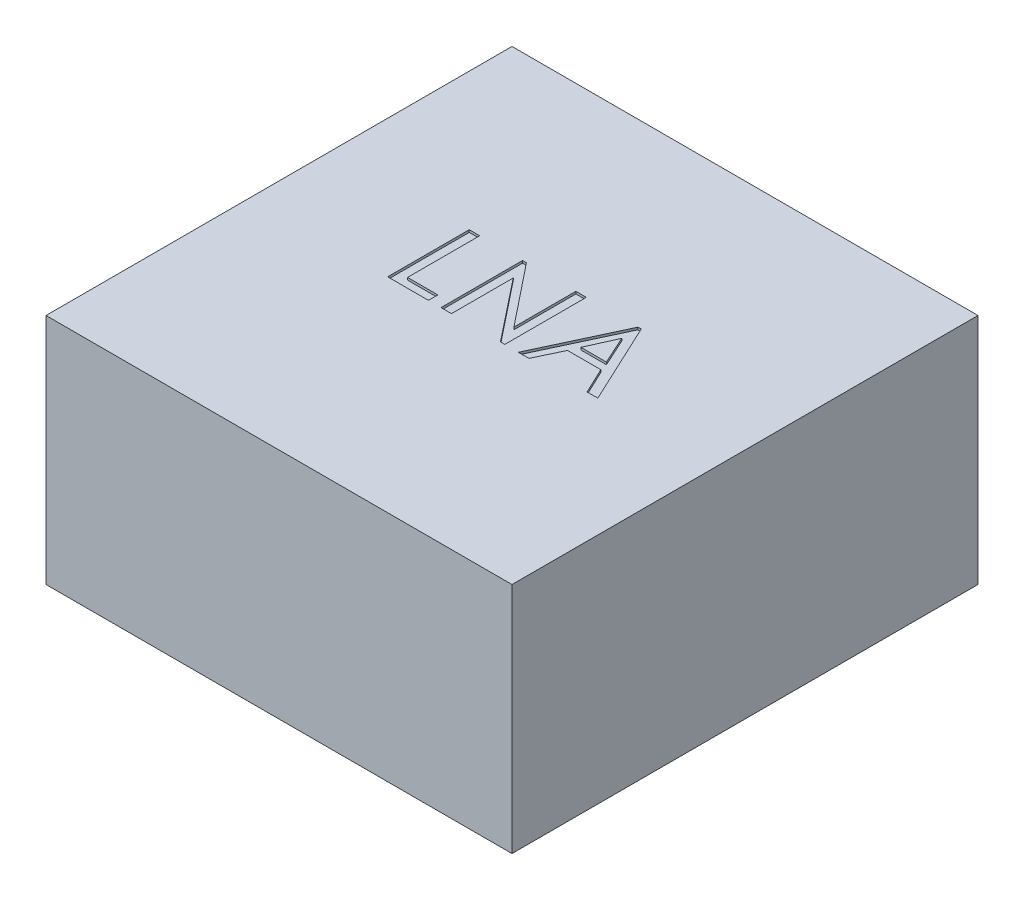
ISO-10303-21;
HEADER;
FILE_DESCRIPTION(('STEP AP214'),'2;1');
FILE_NAME('part.step','',(''),(''),'','','');
FILE_SCHEMA(('AUTOMOTIVE_DESIGN { 1 0 10303 214 1 1 1 1 }'));
ENDSEC;
DATA;
#1=APPLICATION_CONTEXT('core data for automotive mechanical design processes');
#2=APPLICATION_PROTOCOL_DEFINITION('international standard','automotive_design',2000,#1);
#3=PRODUCT_CONTEXT('',#1,'mechanical');
#4=PRODUCT('Part','Part','',(#3));
#5=PRODUCT_RELATED_PRODUCT_CATEGORY('part','',(#4));
#6=PRODUCT_DEFINITION_FORMATION('','',#4);
#7=PRODUCT_DEFINITION_CONTEXT('part definition',#1,'design');
#8=PRODUCT_DEFINITION('design','',#6,#7);
#9=PRODUCT_DEFINITION_SHAPE('','',#8);
#10=(LENGTH_UNIT() NAMED_UNIT(*) SI_UNIT(.MILLI.,.METRE.));
#11=(NAMED_UNIT(*) PLANE_ANGLE_UNIT() SI_UNIT($,.RADIAN.));
#12=(NAMED_UNIT(*) SI_UNIT($,.STERADIAN.) SOLID_ANGLE_UNIT());
#13=UNCERTAINTY_MEASURE_WITH_UNIT(LENGTH_MEASURE(1.E-05),#10,'distance_accuracy_value','');
#14=(GEOMETRIC_REPRESENTATION_CONTEXT(3) GLOBAL_UNCERTAINTY_ASSIGNED_CONTEXT((#13)) GLOBAL_UNIT_ASSIGNED_CONTEXT((#10,
#11,#12)) REPRESENTATION_CONTEXT('',''));
#15=CARTESIAN_POINT('',(0.,0.,0.));
#16=DIRECTION('',(0.,0.,1.));
#17=DIRECTION('',(1.,0.,0.));
#18=AXIS2_PLACEMENT_3D('',#15,#16,#17);
#19=CARTESIAN_POINT('',(0.,10.,0.));
#20=DIRECTION('',(0.,-1.,0.));
#21=DIRECTION('',(0.,0.,-1.));
#22=AXIS2_PLACEMENT_3D('',#19,#20,#21);
#23=PLANE('',#22);
#24=DIRECTION('',(-1.,0.,0.));
#25=VECTOR('',#24,1.);
#26=CARTESIAN_POINT('',(8.63198902594238,10.,-8.76979304217684));
#27=LINE('',#26,#25);
#28=CARTESIAN_POINT('',(8.63198902594238,10.,-8.76979304217684));
#29=VERTEX_POINT('',#28);
#30=CARTESIAN_POINT('',(8.18327107722443,10.,-8.76979304217684));
#31=VERTEX_POINT('',#30);
#32=EDGE_CURVE('E56',#29,#31,#27,.T.);
#33=ORIENTED_EDGE('',*,*,#32,.T.);
#34=DIRECTION('',(0.,0.,-1.));
#35=VECTOR('',#34,1.);
#36=CARTESIAN_POINT('',(8.18327107722443,10.,-8.76979304217684));
#37=LINE('',#36,#35);
#38=CARTESIAN_POINT('',(8.18327107722443,10.,-12.2697930421768));
#39=VERTEX_POINT('',#38);
#40=EDGE_CURVE('E293',#31,#39,#37,.T.);
#41=ORIENTED_EDGE('',*,*,#40,.T.);
#42=DIRECTION('',(1.,0.,0.));
#43=VECTOR('',#42,1.);
#44=CARTESIAN_POINT('',(8.18327107722443,10.,-12.2697930421768));
#45=LINE('',#44,#43);
#46=CARTESIAN_POINT('',(8.34943694260905,10.,-12.2697930421768));
#47=VERTEX_POINT('',#46);
#48=EDGE_CURVE('E297',#39,#47,#45,.T.);
#49=ORIENTED_EDGE('',*,*,#48,.T.);
#50=DIRECTION('',(0.62376479020186,0.,0.781612107444882));
#51=VECTOR('',#50,1.);
#52=CARTESIAN_POINT('',(8.34943694260905,10.,-12.2697930421768));
#53=LINE('',#52,#51);
#54=CARTESIAN_POINT('',(10.471732615686,10.,-9.61043807422813));
#55=VERTEX_POINT('',#54);
#56=EDGE_CURVE('E300',#47,#55,#53,.T.);
#57=ORIENTED_EDGE('',*,*,#56,.T.);
#58=DIRECTION('',(0.,0.,-1.));
#59=VECTOR('',#58,1.);
#60=CARTESIAN_POINT('',(10.471732615686,10.,-9.61043807422813));
#61=LINE('',#60,#59);
#62=CARTESIAN_POINT('',(10.471732615686,10.,-12.2697930421768));
#63=VERTEX_POINT('',#62);
#64=EDGE_CURVE('E303',#55,#63,#61,.T.);
#65=ORIENTED_EDGE('',*,*,#64,.T.);
#66=DIRECTION('',(1.,0.,0.));
#67=VECTOR('',#66,1.);
#68=CARTESIAN_POINT('',(10.471732615686,10.,-12.2697930421768));
#69=LINE('',#68,#67);
#70=CARTESIAN_POINT('',(10.9204505644039,10.,-12.2697930421768));
#71=VERTEX_POINT('',#70);
#72=EDGE_CURVE('E306',#63,#71,#69,.T.);
#73=ORIENTED_EDGE('',*,*,#72,.T.);
#74=DIRECTION('',(0.,0.,1.));
#75=VECTOR('',#74,1.);
#76=CARTESIAN_POINT('',(10.9204505644039,10.,-12.2697930421768));
#77=LINE('',#76,#75);
#78=CARTESIAN_POINT('',(10.9204505644039,10.,-8.76979304217684));
#79=VERTEX_POINT('',#78);
#80=EDGE_CURVE('E309',#71,#79,#77,.T.);
#81=ORIENTED_EDGE('',*,*,#80,.T.);
#82=DIRECTION('',(-1.,0.,0.));
#83=VECTOR('',#82,1.);
#84=CARTESIAN_POINT('',(10.9204505644039,10.,-8.76979304217684));
#85=LINE('',#84,#83);
#86=CARTESIAN_POINT('',(10.7367566541475,10.,-8.76979304217684));
#87=VERTEX_POINT('',#86);
#88=EDGE_CURVE('E312',#79,#87,#85,.T.);
#89=ORIENTED_EDGE('',*,*,#88,.T.);
#90=DIRECTION('',(-0.621609461028976,0.,-0.78332731214944));
#91=VECTOR('',#90,1.);
#92=CARTESIAN_POINT('',(10.7367566541475,10.,-8.76979304217684));
#93=LINE('',#92,#91);
#94=CARTESIAN_POINT('',(8.63198902594238,10.,-11.4221367921768));
#95=VERTEX_POINT('',#94);
#96=EDGE_CURVE('E315',#87,#95,#93,.T.);
#97=ORIENTED_EDGE('',*,*,#96,.T.);
#98=DIRECTION('',(0.,0.,1.));
#99=VECTOR('',#98,1.);
#100=CARTESIAN_POINT('',(8.63198902594238,10.,-11.4221367921768));
#101=LINE('',#100,#99);
#102=EDGE_CURVE('E273',#95,#29,#101,.T.);
#103=ORIENTED_EDGE('',*,*,#102,.T.);
#104=EDGE_LOOP('',(#33,#41,#49,#57,#65,#73,#81,#89,#97,#103));
#105=FACE_BOUND('',#104,.T.);
#106=DIRECTION('',(0.,0.,1.));
#107=VECTOR('',#106,1.);
#108=CARTESIAN_POINT('',(0.,10.,0.));
#109=LINE('',#108,#107);
#110=CARTESIAN_POINT('',(0.,10.,-20.));
#111=VERTEX_POINT('',#110);
#112=CARTESIAN_POINT('',(0.,10.,0.));
#113=VERTEX_POINT('',#112);
#114=EDGE_CURVE('E422',#111,#113,#109,.T.);
#115=ORIENTED_EDGE('',*,*,#114,.T.);
#116=DIRECTION('',(1.,0.,0.));
#117=VECTOR('',#116,1.);
#118=CARTESIAN_POINT('',(0.,10.,0.));
#119=LINE('',#118,#117);
#120=CARTESIAN_POINT('',(20.,10.,0.));
#121=VERTEX_POINT('',#120);
#122=EDGE_CURVE('E425',#113,#121,#119,.T.);
#123=ORIENTED_EDGE('',*,*,#122,.T.);
#124=DIRECTION('',(0.,0.,-1.));
#125=VECTOR('',#124,1.);
#126=CARTESIAN_POINT('',(20.,10.,0.));
#127=LINE('',#126,#125);
#128=CARTESIAN_POINT('',(20.,10.,-20.));
#129=VERTEX_POINT('',#128);
#130=EDGE_CURVE('E428',#121,#129,#127,.T.);
#131=ORIENTED_EDGE('',*,*,#130,.T.);
#132=DIRECTION('',(-1.,0.,0.));
#133=VECTOR('',#132,1.);
#134=CARTESIAN_POINT('',(0.,10.,-20.));
#135=LINE('',#134,#133);
#136=EDGE_CURVE('E430',#129,#111,#135,.T.);
#137=ORIENTED_EDGE('',*,*,#136,.T.);
#138=EDGE_LOOP('',(#115,#123,#131,#137));
#139=FACE_BOUND('',#138,.T.);
#140=DIRECTION('',(1.,0.,0.));
#141=VECTOR('',#140,1.);
#142=CARTESIAN_POINT('',(13.1359954361988,10.,-12.2697930421768));
#143=LINE('',#142,#141);
#144=CARTESIAN_POINT('',(13.1359954361988,10.,-12.2697930421768));
#145=VERTEX_POINT('',#144);
#146=CARTESIAN_POINT('',(13.2762197951731,10.,-12.2697930421768));
#147=VERTEX_POINT('',#146);
#148=EDGE_CURVE('E360',#145,#147,#143,.T.);
#149=ORIENTED_EDGE('',*,*,#148,.T.);
#150=DIRECTION('',(0.423838773095343,0.,0.905737652094156));
#151=VECTOR('',#150,1.);
#152=CARTESIAN_POINT('',(13.2762197951731,10.,-12.2697930421768));
#153=LINE('',#152,#151);
#154=CARTESIAN_POINT('',(14.9140403079937,10.,-8.76979304217684));
#155=VERTEX_POINT('',#154);
#156=EDGE_CURVE('E386',#147,#155,#153,.T.);
#157=ORIENTED_EDGE('',*,*,#156,.T.);
#158=DIRECTION('',(-1.,0.,0.));
#159=VECTOR('',#158,1.);
#160=CARTESIAN_POINT('',(14.9140403079937,10.,-8.76979304217684));
#161=LINE('',#160,#159);
#162=CARTESIAN_POINT('',(14.4534032887629,10.,-8.76979304217684));
#163=VERTEX_POINT('',#162);
#164=EDGE_CURVE('E389',#155,#163,#161,.T.);
#165=ORIENTED_EDGE('',*,*,#164,.T.);
#166=DIRECTION('',(-0.428134903458979,0.,-0.903714835797317));
#167=VECTOR('',#166,1.);
#168=CARTESIAN_POINT('',(14.4534032887629,10.,-8.76979304217684));
#169=LINE('',#168,#167);
#170=CARTESIAN_POINT('',(13.9219529682501,10.,-9.89158791397171));
#171=VERTEX_POINT('',#170);
#172=EDGE_CURVE('E392',#163,#171,#169,.T.);
#173=ORIENTED_EDGE('',*,*,#172,.T.);
#174=DIRECTION('',(-1.,0.,0.));
#175=VECTOR('',#174,1.);
#176=CARTESIAN_POINT('',(13.9219529682501,10.,-9.89158791397171));
#177=LINE('',#176,#175);
#178=CARTESIAN_POINT('',(12.4902622631219,10.,-9.89158791397171));
#179=VERTEX_POINT('',#178);
#180=EDGE_CURVE('E395',#171,#179,#177,.T.);
#181=ORIENTED_EDGE('',*,*,#180,.T.);
#182=DIRECTION('',(-0.428134903458979,0.,0.903714835797317));
#183=VECTOR('',#182,1.);
#184=CARTESIAN_POINT('',(12.4902622631219,10.,-9.89158791397171));
#185=LINE('',#184,#183);
#186=CARTESIAN_POINT('',(11.958811942609,10.,-8.76979304217684));
#187=VERTEX_POINT('',#186);
#188=EDGE_CURVE('E398',#179,#187,#185,.T.);
#189=ORIENTED_EDGE('',*,*,#188,.T.);
#190=DIRECTION('',(-1.,0.,0.));
#191=VECTOR('',#190,1.);
#192=CARTESIAN_POINT('',(11.958811942609,10.,-8.76979304217684));
#193=LINE('',#192,#191);
#194=CARTESIAN_POINT('',(11.5037838977373,10.,-8.76979304217684));
#195=VERTEX_POINT('',#194);
#196=EDGE_CURVE('E401',#187,#195,#193,.T.);
#197=ORIENTED_EDGE('',*,*,#196,.T.);
#198=DIRECTION('',(0.422646918669879,0.,-0.906294423539534));
#199=VECTOR('',#198,1.);
#200=CARTESIAN_POINT('',(11.5037838977373,10.,-8.76979304217684));
#201=LINE('',#200,#199);
#202=EDGE_CURVE('E369',#195,#145,#201,.T.);
#203=ORIENTED_EDGE('',*,*,#202,.T.);
#204=EDGE_LOOP('',(#149,#157,#165,#173,#181,#189,#197,#203));
#205=FACE_BOUND('',#204,.T.);
#206=DIRECTION('',(0.,0.,-1.));
#207=VECTOR('',#206,1.);
#208=CARTESIAN_POINT('',(5.89480953876289,10.,-8.76979304217684));
#209=LINE('',#208,#207);
#210=CARTESIAN_POINT('',(5.89480953876289,10.,-8.76979304217684));
#211=VERTEX_POINT('',#210);
#212=CARTESIAN_POINT('',(5.89480953876289,10.,-12.2697930421768));
#213=VERTEX_POINT('',#212);
#214=EDGE_CURVE('E48',#211,#213,#209,.T.);
#215=ORIENTED_EDGE('',*,*,#214,.T.);
#216=DIRECTION('',(1.,0.,0.));
#217=VECTOR('',#216,1.);
#218=CARTESIAN_POINT('',(5.89480953876289,10.,-12.2697930421768));
#219=LINE('',#218,#217);
#220=CARTESIAN_POINT('',(6.34352748748084,10.,-12.2697930421768));
#221=VERTEX_POINT('',#220);
#222=EDGE_CURVE('E258',#213,#221,#219,.T.);
#223=ORIENTED_EDGE('',*,*,#222,.T.);
#224=DIRECTION('',(0.,0.,1.));
#225=VECTOR('',#224,1.);
#226=CARTESIAN_POINT('',(6.34352748748084,10.,-12.2697930421768));
#227=LINE('',#226,#225);
#228=CARTESIAN_POINT('',(6.34352748748084,10.,-9.173639196023));
#229=VERTEX_POINT('',#228);
#230=EDGE_CURVE('E853',#221,#229,#227,.T.);
#231=ORIENTED_EDGE('',*,*,#230,.T.);
#232=DIRECTION('',(1.,0.,0.));
#233=VECTOR('',#232,1.);
#234=CARTESIAN_POINT('',(6.34352748748084,10.,-9.173639196023));
#235=LINE('',#234,#233);
#236=CARTESIAN_POINT('',(7.64480953876289,10.,-9.173639196023));
#237=VERTEX_POINT('',#236);
#238=EDGE_CURVE('E850',#229,#237,#235,.T.);
#239=ORIENTED_EDGE('',*,*,#238,.T.);
#240=DIRECTION('',(0.,0.,1.));
#241=VECTOR('',#240,1.);
#242=CARTESIAN_POINT('',(7.64480953876289,10.,-9.173639196023));
#243=LINE('',#242,#241);
#244=CARTESIAN_POINT('',(7.64480953876289,10.,-8.76979304217684));
#245=VERTEX_POINT('',#244);
#246=EDGE_CURVE('E844',#237,#245,#243,.T.);
#247=ORIENTED_EDGE('',*,*,#246,.T.);
#248=DIRECTION('',(-1.,0.,0.));
#249=VECTOR('',#248,1.);
#250=CARTESIAN_POINT('',(7.64480953876289,10.,-8.76979304217684));
#251=LINE('',#250,#249);
#252=EDGE_CURVE('E254',#245,#211,#251,.T.);
#253=ORIENTED_EDGE('',*,*,#252,.T.);
#254=EDGE_LOOP('',(#215,#223,#231,#239,#247,#253));
#255=FACE_BOUND('',#254,.T.);
#256=ADVANCED_FACE('F33',(#105,#139,#205,#255),#23,.F.);
#257=CARTESIAN_POINT('',(0.,10.,0.));
#258=DIRECTION('',(1.,0.,0.));
#259=DIRECTION('',(0.,0.,-1.));
#260=AXIS2_PLACEMENT_3D('',#257,#258,#259);
#261=PLANE('',#260);
#262=DIRECTION('',(0.,0.,1.));
#263=VECTOR('',#262,1.);
#264=CARTESIAN_POINT('',(0.,0.,0.));
#265=LINE('',#264,#263);
#266=CARTESIAN_POINT('',(0.,0.,-20.));
#267=VERTEX_POINT('',#266);
#268=CARTESIAN_POINT('',(0.,0.,0.));
#269=VERTEX_POINT('',#268);
#270=EDGE_CURVE('E259',#267,#269,#265,.T.);
#271=ORIENTED_EDGE('',*,*,#270,.T.);
#272=DIRECTION('',(0.,-1.,0.));
#273=VECTOR('',#272,1.);
#274=CARTESIAN_POINT('',(0.,10.,0.));
#275=LINE('',#274,#273);
#276=EDGE_CURVE('E11',#113,#269,#275,.T.);
#277=ORIENTED_EDGE('',*,*,#276,.F.);
#278=ORIENTED_EDGE('',*,*,#114,.F.);
#279=DIRECTION('',(0.,-1.,0.));
#280=VECTOR('',#279,1.);
#281=CARTESIAN_POINT('',(0.,10.,-20.));
#282=LINE('',#281,#280);
#283=EDGE_CURVE('E431',#111,#267,#282,.T.);
#284=ORIENTED_EDGE('',*,*,#283,.T.);
#285=EDGE_LOOP('',(#271,#277,#278,#284));
#286=FACE_BOUND('',#285,.T.);
#287=ADVANCED_FACE('F35',(#286),#261,.F.);
#288=CARTESIAN_POINT('',(0.,10.,0.));
#289=DIRECTION('',(0.,0.,-1.));
#290=DIRECTION('',(-1.,0.,0.));
#291=AXIS2_PLACEMENT_3D('',#288,#289,#290);
#292=PLANE('',#291);
#293=DIRECTION('',(1.,0.,0.));
#294=VECTOR('',#293,1.);
#295=CARTESIAN_POINT('',(0.,0.,0.));
#296=LINE('',#295,#294);
#297=CARTESIAN_POINT('',(20.,0.,0.));
#298=VERTEX_POINT('',#297);
#299=EDGE_CURVE('E263',#269,#298,#296,.T.);
#300=ORIENTED_EDGE('',*,*,#299,.T.);
#301=DIRECTION('',(0.,-1.,0.));
#302=VECTOR('',#301,1.);
#303=CARTESIAN_POINT('',(20.,10.,0.));
#304=LINE('',#303,#302);
#305=EDGE_CURVE('E41',#121,#298,#304,.T.);
#306=ORIENTED_EDGE('',*,*,#305,.F.);
#307=ORIENTED_EDGE('',*,*,#122,.F.);
#308=ORIENTED_EDGE('',*,*,#276,.T.);
#309=EDGE_LOOP('',(#300,#306,#307,#308));
#310=FACE_BOUND('',#309,.T.);
#311=ADVANCED_FACE('F462',(#310),#292,.F.);
#312=CARTESIAN_POINT('',(20.,10.,0.));
#313=DIRECTION('',(-1.,0.,0.));
#314=DIRECTION('',(0.,0.,1.));
#315=AXIS2_PLACEMENT_3D('',#312,#313,#314);
#316=PLANE('',#315);
#317=DIRECTION('',(0.,0.,-1.));
#318=VECTOR('',#317,1.);
#319=CARTESIAN_POINT('',(20.,0.,0.));
#320=LINE('',#319,#318);
#321=CARTESIAN_POINT('',(20.,0.,-20.));
#322=VERTEX_POINT('',#321);
#323=EDGE_CURVE('E434',#298,#322,#320,.T.);
#324=ORIENTED_EDGE('',*,*,#323,.T.);
#325=DIRECTION('',(0.,-1.,0.));
#326=VECTOR('',#325,1.);
#327=CARTESIAN_POINT('',(20.,10.,-20.));
#328=LINE('',#327,#326);
#329=EDGE_CURVE('E439',#129,#322,#328,.T.);
#330=ORIENTED_EDGE('',*,*,#329,.F.);
#331=ORIENTED_EDGE('',*,*,#130,.F.);
#332=ORIENTED_EDGE('',*,*,#305,.T.);
#333=EDGE_LOOP('',(#324,#330,#331,#332));
#334=FACE_BOUND('',#333,.T.);
#335=ADVANCED_FACE('F446',(#334),#316,.F.);
#336=CARTESIAN_POINT('',(0.,10.,-20.));
#337=DIRECTION('',(0.,0.,1.));
#338=DIRECTION('',(1.,0.,0.));
#339=AXIS2_PLACEMENT_3D('',#336,#337,#338);
#340=PLANE('',#339);
#341=DIRECTION('',(-1.,0.,0.));
#342=VECTOR('',#341,1.);
#343=CARTESIAN_POINT('',(0.,0.,-20.));
#344=LINE('',#343,#342);
#345=EDGE_CURVE('E426',#322,#267,#344,.T.);
#346=ORIENTED_EDGE('',*,*,#345,.T.);
#347=ORIENTED_EDGE('',*,*,#283,.F.);
#348=ORIENTED_EDGE('',*,*,#136,.F.);
#349=ORIENTED_EDGE('',*,*,#329,.T.);
#350=EDGE_LOOP('',(#346,#347,#348,#349));
#351=FACE_BOUND('',#350,.T.);
#352=ADVANCED_FACE('F455',(#351),#340,.F.);
#353=CARTESIAN_POINT('',(0.,0.,0.));
#354=DIRECTION('',(0.,-1.,0.));
#355=DIRECTION('',(0.,0.,-1.));
#356=AXIS2_PLACEMENT_3D('',#353,#354,#355);
#357=PLANE('',#356);
#358=ORIENTED_EDGE('',*,*,#270,.F.);
#359=ORIENTED_EDGE('',*,*,#345,.F.);
#360=ORIENTED_EDGE('',*,*,#323,.F.);
#361=ORIENTED_EDGE('',*,*,#299,.F.);
#362=EDGE_LOOP('',(#358,#359,#360,#361));
#363=FACE_BOUND('',#362,.T.);
#364=ADVANCED_FACE('F452',(#363),#357,.T.);
#365=CARTESIAN_POINT('',(13.1359954361988,9.9,-12.2697930421768));
#366=DIRECTION('',(0.,0.,1.));
#367=DIRECTION('',(1.,0.,0.));
#368=AXIS2_PLACEMENT_3D('',#365,#366,#367);
#369=PLANE('',#368);
#370=ORIENTED_EDGE('',*,*,#148,.F.);
#371=DIRECTION('',(0.,1.,0.));
#372=VECTOR('',#371,1.);
#373=CARTESIAN_POINT('',(13.1359954361988,9.9,-12.2697930421768));
#374=LINE('',#373,#372);
#375=CARTESIAN_POINT('',(13.1359954361988,9.9,-12.2697930421768));
#376=VERTEX_POINT('',#375);
#377=EDGE_CURVE('E383',#376,#145,#374,.T.);
#378=ORIENTED_EDGE('',*,*,#377,.F.);
#379=DIRECTION('',(1.,0.,0.));
#380=VECTOR('',#379,1.);
#381=CARTESIAN_POINT('',(13.1359954361988,9.9,-12.2697930421768));
#382=LINE('',#381,#380);
#383=CARTESIAN_POINT('',(13.2762197951731,9.9,-12.2697930421768));
#384=VERTEX_POINT('',#383);
#385=EDGE_CURVE('E365',#376,#384,#382,.T.);
#386=ORIENTED_EDGE('',*,*,#385,.T.);
#387=DIRECTION('',(0.,1.,0.));
#388=VECTOR('',#387,1.);
#389=CARTESIAN_POINT('',(13.2762197951731,9.9,-12.2697930421768));
#390=LINE('',#389,#388);
#391=EDGE_CURVE('E294',#384,#147,#390,.T.);
#392=ORIENTED_EDGE('',*,*,#391,.T.);
#393=EDGE_LOOP('',(#370,#378,#386,#392));
#394=FACE_BOUND('',#393,.T.);
#395=ADVANCED_FACE('F508',(#394),#369,.T.);
#396=CARTESIAN_POINT('',(13.2762197951731,9.9,-12.2697930421768));
#397=DIRECTION('',(-0.905737652094156,0.,0.423838773095343));
#398=DIRECTION('',(0.423838773095343,0.,0.905737652094156));
#399=AXIS2_PLACEMENT_3D('',#396,#397,#398);
#400=PLANE('',#399);
#401=ORIENTED_EDGE('',*,*,#156,.F.);
#402=ORIENTED_EDGE('',*,*,#391,.F.);
#403=DIRECTION('',(0.423838773095343,0.,0.905737652094156));
#404=VECTOR('',#403,1.);
#405=CARTESIAN_POINT('',(13.2762197951731,9.9,-12.2697930421768));
#406=LINE('',#405,#404);
#407=CARTESIAN_POINT('',(14.9140403079937,9.9,-8.76979304217684));
#408=VERTEX_POINT('',#407);
#409=EDGE_CURVE('E368',#384,#408,#406,.T.);
#410=ORIENTED_EDGE('',*,*,#409,.T.);
#411=DIRECTION('',(0.,1.,0.));
#412=VECTOR('',#411,1.);
#413=CARTESIAN_POINT('',(14.9140403079937,9.9,-8.76979304217684));
#414=LINE('',#413,#412);
#415=EDGE_CURVE('E418',#408,#155,#414,.T.);
#416=ORIENTED_EDGE('',*,*,#415,.T.);
#417=EDGE_LOOP('',(#401,#402,#410,#416));
#418=FACE_BOUND('',#417,.T.);
#419=ADVANCED_FACE('F510',(#418),#400,.T.);
#420=CARTESIAN_POINT('',(14.9140403079937,9.9,-8.76979304217684));
#421=DIRECTION('',(0.,0.,-1.));
#422=DIRECTION('',(-1.,0.,0.));
#423=AXIS2_PLACEMENT_3D('',#420,#421,#422);
#424=PLANE('',#423);
#425=ORIENTED_EDGE('',*,*,#164,.F.);
#426=ORIENTED_EDGE('',*,*,#415,.F.);
#427=DIRECTION('',(-1.,0.,0.));
#428=VECTOR('',#427,1.);
#429=CARTESIAN_POINT('',(14.9140403079937,9.9,-8.76979304217684));
#430=LINE('',#429,#428);
#431=CARTESIAN_POINT('',(14.4534032887629,9.9,-8.76979304217684));
#432=VERTEX_POINT('',#431);
#433=EDGE_CURVE('E371',#408,#432,#430,.T.);
#434=ORIENTED_EDGE('',*,*,#433,.T.);
#435=DIRECTION('',(0.,1.,0.));
#436=VECTOR('',#435,1.);
#437=CARTESIAN_POINT('',(14.4534032887629,9.9,-8.76979304217684));
#438=LINE('',#437,#436);
#439=EDGE_CURVE('E416',#432,#163,#438,.T.);
#440=ORIENTED_EDGE('',*,*,#439,.T.);
#441=EDGE_LOOP('',(#425,#426,#434,#440));
#442=FACE_BOUND('',#441,.T.);
#443=ADVANCED_FACE('F537',(#442),#424,.T.);
#444=CARTESIAN_POINT('',(14.4534032887629,9.9,-8.76979304217684));
#445=DIRECTION('',(0.903714835797317,0.,-0.428134903458979));
#446=DIRECTION('',(-0.428134903458979,0.,-0.903714835797317));
#447=AXIS2_PLACEMENT_3D('',#444,#445,#446);
#448=PLANE('',#447);
#449=ORIENTED_EDGE('',*,*,#172,.F.);
#450=ORIENTED_EDGE('',*,*,#439,.F.);
#451=DIRECTION('',(-0.428134903458979,0.,-0.903714835797317));
#452=VECTOR('',#451,1.);
#453=CARTESIAN_POINT('',(14.4534032887629,9.9,-8.76979304217684));
#454=LINE('',#453,#452);
#455=CARTESIAN_POINT('',(13.9219529682501,9.9,-9.89158791397171));
#456=VERTEX_POINT('',#455);
#457=EDGE_CURVE('E373',#432,#456,#454,.T.);
#458=ORIENTED_EDGE('',*,*,#457,.T.);
#459=DIRECTION('',(0.,1.,0.));
#460=VECTOR('',#459,1.);
#461=CARTESIAN_POINT('',(13.9219529682501,9.9,-9.89158791397171));
#462=LINE('',#461,#460);
#463=EDGE_CURVE('E414',#456,#171,#462,.T.);
#464=ORIENTED_EDGE('',*,*,#463,.T.);
#465=EDGE_LOOP('',(#449,#450,#458,#464));
#466=FACE_BOUND('',#465,.T.);
#467=ADVANCED_FACE('F534',(#466),#448,.T.);
#468=CARTESIAN_POINT('',(13.9219529682501,9.9,-9.89158791397171));
#469=DIRECTION('',(0.,0.,-1.));
#470=DIRECTION('',(-1.,0.,0.));
#471=AXIS2_PLACEMENT_3D('',#468,#469,#470);
#472=PLANE('',#471);
#473=ORIENTED_EDGE('',*,*,#180,.F.);
#474=ORIENTED_EDGE('',*,*,#463,.F.);
#475=DIRECTION('',(-1.,0.,0.));
#476=VECTOR('',#475,1.);
#477=CARTESIAN_POINT('',(13.9219529682501,9.9,-9.89158791397171));
#478=LINE('',#477,#476);
#479=CARTESIAN_POINT('',(12.4902622631219,9.9,-9.89158791397171));
#480=VERTEX_POINT('',#479);
#481=EDGE_CURVE('E375',#456,#480,#478,.T.);
#482=ORIENTED_EDGE('',*,*,#481,.T.);
#483=DIRECTION('',(0.,1.,0.));
#484=VECTOR('',#483,1.);
#485=CARTESIAN_POINT('',(12.4902622631219,9.9,-9.89158791397171));
#486=LINE('',#485,#484);
#487=EDGE_CURVE('E412',#480,#179,#486,.T.);
#488=ORIENTED_EDGE('',*,*,#487,.T.);
#489=EDGE_LOOP('',(#473,#474,#482,#488));
#490=FACE_BOUND('',#489,.T.);
#491=ADVANCED_FACE('F530',(#490),#472,.T.);
#492=CARTESIAN_POINT('',(12.4902622631219,9.9,-9.89158791397171));
#493=DIRECTION('',(-0.903714835797317,0.,-0.428134903458979));
#494=DIRECTION('',(-0.428134903458979,0.,0.903714835797317));
#495=AXIS2_PLACEMENT_3D('',#492,#493,#494);
#496=PLANE('',#495);
#497=ORIENTED_EDGE('',*,*,#188,.F.);
#498=ORIENTED_EDGE('',*,*,#487,.F.);
#499=DIRECTION('',(-0.428134903458979,0.,0.903714835797317));
#500=VECTOR('',#499,1.);
#501=CARTESIAN_POINT('',(12.4902622631219,9.9,-9.89158791397171));
#502=LINE('',#501,#500);
#503=CARTESIAN_POINT('',(11.958811942609,9.9,-8.76979304217684));
#504=VERTEX_POINT('',#503);
#505=EDGE_CURVE('E377',#480,#504,#502,.T.);
#506=ORIENTED_EDGE('',*,*,#505,.T.);
#507=DIRECTION('',(0.,1.,0.));
#508=VECTOR('',#507,1.);
#509=CARTESIAN_POINT('',(11.958811942609,9.9,-8.76979304217684));
#510=LINE('',#509,#508);
#511=EDGE_CURVE('E410',#504,#187,#510,.T.);
#512=ORIENTED_EDGE('',*,*,#511,.T.);
#513=EDGE_LOOP('',(#497,#498,#506,#512));
#514=FACE_BOUND('',#513,.T.);
#515=ADVANCED_FACE('F527',(#514),#496,.T.);
#516=CARTESIAN_POINT('',(11.958811942609,9.9,-8.76979304217684));
#517=DIRECTION('',(0.,0.,-1.));
#518=DIRECTION('',(-1.,0.,0.));
#519=AXIS2_PLACEMENT_3D('',#516,#517,#518);
#520=PLANE('',#519);
#521=ORIENTED_EDGE('',*,*,#196,.F.);
#522=ORIENTED_EDGE('',*,*,#511,.F.);
#523=DIRECTION('',(-1.,0.,0.));
#524=VECTOR('',#523,1.);
#525=CARTESIAN_POINT('',(11.958811942609,9.9,-8.76979304217684));
#526=LINE('',#525,#524);
#527=CARTESIAN_POINT('',(11.5037838977373,9.9,-8.76979304217684));
#528=VERTEX_POINT('',#527);
#529=EDGE_CURVE('E379',#504,#528,#526,.T.);
#530=ORIENTED_EDGE('',*,*,#529,.T.);
#531=DIRECTION('',(0.,1.,0.));
#532=VECTOR('',#531,1.);
#533=CARTESIAN_POINT('',(11.5037838977373,9.9,-8.76979304217684));
#534=LINE('',#533,#532);
#535=EDGE_CURVE('E408',#528,#195,#534,.T.);
#536=ORIENTED_EDGE('',*,*,#535,.T.);
#537=EDGE_LOOP('',(#521,#522,#530,#536));
#538=FACE_BOUND('',#537,.T.);
#539=ADVANCED_FACE('F519',(#538),#520,.T.);
#540=CARTESIAN_POINT('',(11.5037838977373,9.9,-8.76979304217684));
#541=DIRECTION('',(0.906294423539534,0.,0.422646918669879));
#542=DIRECTION('',(0.422646918669879,0.,-0.906294423539534));
#543=AXIS2_PLACEMENT_3D('',#540,#541,#542);
#544=PLANE('',#543);
#545=ORIENTED_EDGE('',*,*,#202,.F.);
#546=ORIENTED_EDGE('',*,*,#535,.F.);
#547=DIRECTION('',(0.422646918669879,0.,-0.906294423539534));
#548=VECTOR('',#547,1.);
#549=CARTESIAN_POINT('',(11.5037838977373,9.9,-8.76979304217684));
#550=LINE('',#549,#548);
#551=EDGE_CURVE('E381',#528,#376,#550,.T.);
#552=ORIENTED_EDGE('',*,*,#551,.T.);
#553=ORIENTED_EDGE('',*,*,#377,.T.);
#554=EDGE_LOOP('',(#545,#546,#552,#553));
#555=FACE_BOUND('',#554,.T.);
#556=ADVANCED_FACE('F499',(#555),#544,.T.);
#557=CARTESIAN_POINT('',(0.,9.9,0.));
#558=DIRECTION('',(0.,1.,0.));
#559=DIRECTION('',(0.,0.,1.));
#560=AXIS2_PLACEMENT_3D('',#557,#558,#559);
#561=PLANE('',#560);
#562=DIRECTION('',(1.,0.,0.));
#563=VECTOR('',#562,1.);
#564=CARTESIAN_POINT('',(12.6613359810706,9.9,-10.2954340678179));
#565=LINE('',#564,#563);
#566=CARTESIAN_POINT('',(12.6613359810706,9.9,-10.2954340678179));
#567=VERTEX_POINT('',#566);
#568=CARTESIAN_POINT('',(13.7564882246603,9.9,-10.2954340678179));
#569=VERTEX_POINT('',#568);
#570=EDGE_CURVE('E346',#567,#569,#565,.T.);
#571=ORIENTED_EDGE('',*,*,#570,.F.);
#572=DIRECTION('',(-0.410694316281437,0.,0.911773095991609));
#573=VECTOR('',#572,1.);
#574=CARTESIAN_POINT('',(13.206107615686,9.9,-11.5048691639717));
#575=LINE('',#574,#573);
#576=CARTESIAN_POINT('',(13.206107615686,9.9,-11.5048691639717));
#577=VERTEX_POINT('',#576);
#578=EDGE_CURVE('E342',#577,#567,#575,.T.);
#579=ORIENTED_EDGE('',*,*,#578,.F.);
#580=DIRECTION('',(-0.414200444755634,0.,-0.910185690705054));
#581=VECTOR('',#580,1.);
#582=CARTESIAN_POINT('',(13.7564882246603,9.9,-10.2954340678179));
#583=LINE('',#582,#581);
#584=EDGE_CURVE('E339',#569,#577,#583,.T.);
#585=ORIENTED_EDGE('',*,*,#584,.F.);
#586=EDGE_LOOP('',(#571,#579,#585));
#587=FACE_BOUND('',#586,.T.);
#588=ORIENTED_EDGE('',*,*,#385,.F.);
#589=ORIENTED_EDGE('',*,*,#551,.F.);
#590=ORIENTED_EDGE('',*,*,#529,.F.);
#591=ORIENTED_EDGE('',*,*,#505,.F.);
#592=ORIENTED_EDGE('',*,*,#481,.F.);
#593=ORIENTED_EDGE('',*,*,#457,.F.);
#594=ORIENTED_EDGE('',*,*,#433,.F.);
#595=ORIENTED_EDGE('',*,*,#409,.F.);
#596=EDGE_LOOP('',(#588,#589,#590,#591,#592,#593,#594,#595));
#597=FACE_BOUND('',#596,.T.);
#598=ADVANCED_FACE('F496',(#587,#597),#561,.T.);
#599=CARTESIAN_POINT('',(13.7564882246603,9.9,-10.2954340678179));
#600=DIRECTION('',(0.910185690705054,0.,-0.414200444755634));
#601=DIRECTION('',(-0.414200444755634,0.,-0.910185690705054));
#602=AXIS2_PLACEMENT_3D('',#599,#600,#601);
#603=PLANE('',#602);
#604=DIRECTION('',(-0.414200444755634,0.,-0.910185690705054));
#605=VECTOR('',#604,1.);
#606=CARTESIAN_POINT('',(13.7564882246603,10.,-10.2954340678179));
#607=LINE('',#606,#605);
#608=CARTESIAN_POINT('',(13.7564882246603,10.,-10.2954340678179));
#609=VERTEX_POINT('',#608);
#610=CARTESIAN_POINT('',(13.206107615686,10.,-11.5048691639717));
#611=VERTEX_POINT('',#610);
#612=EDGE_CURVE('E350',#609,#611,#607,.T.);
#613=ORIENTED_EDGE('',*,*,#612,.F.);
#614=DIRECTION('',(0.,1.,0.));
#615=VECTOR('',#614,1.);
#616=CARTESIAN_POINT('',(13.7564882246603,9.9,-10.2954340678179));
#617=LINE('',#616,#615);
#618=EDGE_CURVE('E358',#569,#609,#617,.T.);
#619=ORIENTED_EDGE('',*,*,#618,.F.);
#620=ORIENTED_EDGE('',*,*,#584,.T.);
#621=DIRECTION('',(0.,1.,0.));
#622=VECTOR('',#621,1.);
#623=CARTESIAN_POINT('',(13.206107615686,9.9,-11.5048691639717));
#624=LINE('',#623,#622);
#625=EDGE_CURVE('E349',#577,#611,#624,.T.);
#626=ORIENTED_EDGE('',*,*,#625,.T.);
#627=EDGE_LOOP('',(#613,#619,#620,#626));
#628=FACE_BOUND('',#627,.T.);
#629=ADVANCED_FACE('F487',(#628),#603,.T.);
#630=CARTESIAN_POINT('',(12.6613359810706,9.9,-10.2954340678179));
#631=DIRECTION('',(0.,0.,1.));
#632=DIRECTION('',(1.,0.,0.));
#633=AXIS2_PLACEMENT_3D('',#630,#631,#632);
#634=PLANE('',#633);
#635=DIRECTION('',(1.,0.,0.));
#636=VECTOR('',#635,1.);
#637=CARTESIAN_POINT('',(12.6613359810706,10.,-10.2954340678179));
#638=LINE('',#637,#636);
#639=CARTESIAN_POINT('',(12.6613359810706,10.,-10.2954340678179));
#640=VERTEX_POINT('',#639);
#641=EDGE_CURVE('E343',#640,#609,#638,.T.);
#642=ORIENTED_EDGE('',*,*,#641,.F.);
#643=DIRECTION('',(0.,1.,0.));
#644=VECTOR('',#643,1.);
#645=CARTESIAN_POINT('',(12.6613359810706,9.9,-10.2954340678179));
#646=LINE('',#645,#644);
#647=EDGE_CURVE('E361',#567,#640,#646,.T.);
#648=ORIENTED_EDGE('',*,*,#647,.F.);
#649=ORIENTED_EDGE('',*,*,#570,.T.);
#650=ORIENTED_EDGE('',*,*,#618,.T.);
#651=EDGE_LOOP('',(#642,#648,#649,#650));
#652=FACE_BOUND('',#651,.T.);
#653=ADVANCED_FACE('F494',(#652),#634,.T.);
#654=CARTESIAN_POINT('',(13.206107615686,9.9,-11.5048691639717));
#655=DIRECTION('',(-0.911773095991609,0.,-0.410694316281437));
#656=DIRECTION('',(-0.410694316281437,0.,0.911773095991609));
#657=AXIS2_PLACEMENT_3D('',#654,#655,#656);
#658=PLANE('',#657);
#659=DIRECTION('',(-0.410694316281437,0.,0.911773095991609));
#660=VECTOR('',#659,1.);
#661=CARTESIAN_POINT('',(13.206107615686,10.,-11.5048691639717));
#662=LINE('',#661,#660);
#663=EDGE_CURVE('E353',#611,#640,#662,.T.);
#664=ORIENTED_EDGE('',*,*,#663,.F.);
#665=ORIENTED_EDGE('',*,*,#625,.F.);
#666=ORIENTED_EDGE('',*,*,#578,.T.);
#667=ORIENTED_EDGE('',*,*,#647,.T.);
#668=EDGE_LOOP('',(#664,#665,#666,#667));
#669=FACE_BOUND('',#668,.T.);
#670=ADVANCED_FACE('F491',(#669),#658,.T.);
#671=CARTESIAN_POINT('',(8.63198902594238,9.9,-8.76979304217684));
#672=DIRECTION('',(0.,0.,-1.));
#673=DIRECTION('',(-1.,0.,0.));
#674=AXIS2_PLACEMENT_3D('',#671,#672,#673);
#675=PLANE('',#674);
#676=ORIENTED_EDGE('',*,*,#32,.F.);
#677=DIRECTION('',(0.,1.,0.));
#678=VECTOR('',#677,1.);
#679=CARTESIAN_POINT('',(8.63198902594238,9.9,-8.76979304217684));
#680=LINE('',#679,#678);
#681=CARTESIAN_POINT('',(8.63198902594238,9.9,-8.76979304217684));
#682=VERTEX_POINT('',#681);
#683=EDGE_CURVE('E291',#682,#29,#680,.T.);
#684=ORIENTED_EDGE('',*,*,#683,.F.);
#685=DIRECTION('',(-1.,0.,0.));
#686=VECTOR('',#685,1.);
#687=CARTESIAN_POINT('',(8.63198902594238,9.9,-8.76979304217684));
#688=LINE('',#687,#686);
#689=CARTESIAN_POINT('',(8.18327107722443,9.9,-8.76979304217684));
#690=VERTEX_POINT('',#689);
#691=EDGE_CURVE('E269',#682,#690,#688,.T.);
#692=ORIENTED_EDGE('',*,*,#691,.T.);
#693=DIRECTION('',(0.,1.,0.));
#694=VECTOR('',#693,1.);
#695=CARTESIAN_POINT('',(8.18327107722443,9.9,-8.76979304217684));
#696=LINE('',#695,#694);
#697=EDGE_CURVE('E337',#690,#31,#696,.T.);
#698=ORIENTED_EDGE('',*,*,#697,.T.);
#699=EDGE_LOOP('',(#676,#684,#692,#698));
#700=FACE_BOUND('',#699,.T.);
#701=ADVANCED_FACE('F660',(#700),#675,.T.);
#702=CARTESIAN_POINT('',(8.18327107722443,9.9,-8.76979304217684));
#703=DIRECTION('',(1.,0.,0.));
#704=DIRECTION('',(0.,0.,-1.));
#705=AXIS2_PLACEMENT_3D('',#702,#703,#704);
#706=PLANE('',#705);
#707=ORIENTED_EDGE('',*,*,#40,.F.);
#708=ORIENTED_EDGE('',*,*,#697,.F.);
#709=DIRECTION('',(0.,0.,-1.));
#710=VECTOR('',#709,1.);
#711=CARTESIAN_POINT('',(8.18327107722443,9.9,-8.76979304217684));
#712=LINE('',#711,#710);
#713=CARTESIAN_POINT('',(8.18327107722443,9.9,-12.2697930421768));
#714=VERTEX_POINT('',#713);
#715=EDGE_CURVE('E272',#690,#714,#712,.T.);
#716=ORIENTED_EDGE('',*,*,#715,.T.);
#717=DIRECTION('',(0.,1.,0.));
#718=VECTOR('',#717,1.);
#719=CARTESIAN_POINT('',(8.18327107722443,9.9,-12.2697930421768));
#720=LINE('',#719,#718);
#721=EDGE_CURVE('E335',#714,#39,#720,.T.);
#722=ORIENTED_EDGE('',*,*,#721,.T.);
#723=EDGE_LOOP('',(#707,#708,#716,#722));
#724=FACE_BOUND('',#723,.T.);
#725=ADVANCED_FACE('F668',(#724),#706,.T.);
#726=CARTESIAN_POINT('',(8.18327107722443,9.9,-12.2697930421768));
#727=DIRECTION('',(0.,0.,1.));
#728=DIRECTION('',(1.,0.,0.));
#729=AXIS2_PLACEMENT_3D('',#726,#727,#728);
#730=PLANE('',#729);
#731=ORIENTED_EDGE('',*,*,#48,.F.);
#732=ORIENTED_EDGE('',*,*,#721,.F.);
#733=DIRECTION('',(1.,0.,0.));
#734=VECTOR('',#733,1.);
#735=CARTESIAN_POINT('',(8.18327107722443,9.9,-12.2697930421768));
#736=LINE('',#735,#734);
#737=CARTESIAN_POINT('',(8.34943694260905,9.9,-12.2697930421768));
#738=VERTEX_POINT('',#737);
#739=EDGE_CURVE('E275',#714,#738,#736,.T.);
#740=ORIENTED_EDGE('',*,*,#739,.T.);
#741=DIRECTION('',(0.,1.,0.));
#742=VECTOR('',#741,1.);
#743=CARTESIAN_POINT('',(8.34943694260905,9.9,-12.2697930421768));
#744=LINE('',#743,#742);
#745=EDGE_CURVE('E333',#738,#47,#744,.T.);
#746=ORIENTED_EDGE('',*,*,#745,.T.);
#747=EDGE_LOOP('',(#731,#732,#740,#746));
#748=FACE_BOUND('',#747,.T.);
#749=ADVANCED_FACE('F676',(#748),#730,.T.);
#750=CARTESIAN_POINT('',(8.34943694260905,9.9,-12.2697930421768));
#751=DIRECTION('',(-0.781612107444882,0.,0.62376479020186));
#752=DIRECTION('',(0.62376479020186,0.,0.781612107444882));
#753=AXIS2_PLACEMENT_3D('',#750,#751,#752);
#754=PLANE('',#753);
#755=ORIENTED_EDGE('',*,*,#56,.F.);
#756=ORIENTED_EDGE('',*,*,#745,.F.);
#757=DIRECTION('',(0.62376479020186,0.,0.781612107444882));
#758=VECTOR('',#757,1.);
#759=CARTESIAN_POINT('',(8.34943694260905,9.9,-12.2697930421768));
#760=LINE('',#759,#758);
#761=CARTESIAN_POINT('',(10.471732615686,9.9,-9.61043807422813));
#762=VERTEX_POINT('',#761);
#763=EDGE_CURVE('E277',#738,#762,#760,.T.);
#764=ORIENTED_EDGE('',*,*,#763,.T.);
#765=DIRECTION('',(0.,1.,0.));
#766=VECTOR('',#765,1.);
#767=CARTESIAN_POINT('',(10.471732615686,9.9,-9.61043807422813));
#768=LINE('',#767,#766);
#769=EDGE_CURVE('E331',#762,#55,#768,.T.);
#770=ORIENTED_EDGE('',*,*,#769,.T.);
#771=EDGE_LOOP('',(#755,#756,#764,#770));
#772=FACE_BOUND('',#771,.T.);
#773=ADVANCED_FACE('F685',(#772),#754,.T.);
#774=CARTESIAN_POINT('',(10.471732615686,9.9,-9.61043807422813));
#775=DIRECTION('',(1.,0.,0.));
#776=DIRECTION('',(0.,0.,-1.));
#777=AXIS2_PLACEMENT_3D('',#774,#775,#776);
#778=PLANE('',#777);
#779=ORIENTED_EDGE('',*,*,#64,.F.);
#780=ORIENTED_EDGE('',*,*,#769,.F.);
#781=DIRECTION('',(0.,0.,-1.));
#782=VECTOR('',#781,1.);
#783=CARTESIAN_POINT('',(10.471732615686,9.9,-9.61043807422813));
#784=LINE('',#783,#782);
#785=CARTESIAN_POINT('',(10.471732615686,9.9,-12.2697930421768));
#786=VERTEX_POINT('',#785);
#787=EDGE_CURVE('E279',#762,#786,#784,.T.);
#788=ORIENTED_EDGE('',*,*,#787,.T.);
#789=DIRECTION('',(0.,1.,0.));
#790=VECTOR('',#789,1.);
#791=CARTESIAN_POINT('',(10.471732615686,9.9,-12.2697930421768));
#792=LINE('',#791,#790);
#793=EDGE_CURVE('E329',#786,#63,#792,.T.);
#794=ORIENTED_EDGE('',*,*,#793,.T.);
#795=EDGE_LOOP('',(#779,#780,#788,#794));
#796=FACE_BOUND('',#795,.T.);
#797=ADVANCED_FACE('F694',(#796),#778,.T.);
#798=CARTESIAN_POINT('',(10.471732615686,9.9,-12.2697930421768));
#799=DIRECTION('',(0.,0.,1.));
#800=DIRECTION('',(1.,0.,0.));
#801=AXIS2_PLACEMENT_3D('',#798,#799,#800);
#802=PLANE('',#801);
#803=ORIENTED_EDGE('',*,*,#72,.F.);
#804=ORIENTED_EDGE('',*,*,#793,.F.);
#805=DIRECTION('',(1.,0.,0.));
#806=VECTOR('',#805,1.);
#807=CARTESIAN_POINT('',(10.471732615686,9.9,-12.2697930421768));
#808=LINE('',#807,#806);
#809=CARTESIAN_POINT('',(10.9204505644039,9.9,-12.2697930421768));
#810=VERTEX_POINT('',#809);
#811=EDGE_CURVE('E281',#786,#810,#808,.T.);
#812=ORIENTED_EDGE('',*,*,#811,.T.);
#813=DIRECTION('',(0.,1.,0.));
#814=VECTOR('',#813,1.);
#815=CARTESIAN_POINT('',(10.9204505644039,9.9,-12.2697930421768));
#816=LINE('',#815,#814);
#817=EDGE_CURVE('E327',#810,#71,#816,.T.);
#818=ORIENTED_EDGE('',*,*,#817,.T.);
#819=EDGE_LOOP('',(#803,#804,#812,#818));
#820=FACE_BOUND('',#819,.T.);
#821=ADVANCED_FACE('F703',(#820),#802,.T.);
#822=CARTESIAN_POINT('',(10.9204505644039,9.9,-12.2697930421768));
#823=DIRECTION('',(-1.,0.,0.));
#824=DIRECTION('',(0.,0.,1.));
#825=AXIS2_PLACEMENT_3D('',#822,#823,#824);
#826=PLANE('',#825);
#827=ORIENTED_EDGE('',*,*,#80,.F.);
#828=ORIENTED_EDGE('',*,*,#817,.F.);
#829=DIRECTION('',(0.,0.,1.));
#830=VECTOR('',#829,1.);
#831=CARTESIAN_POINT('',(10.9204505644039,9.9,-12.2697930421768));
#832=LINE('',#831,#830);
#833=CARTESIAN_POINT('',(10.9204505644039,9.9,-8.76979304217684));
#834=VERTEX_POINT('',#833);
#835=EDGE_CURVE('E283',#810,#834,#832,.T.);
#836=ORIENTED_EDGE('',*,*,#835,.T.);
#837=DIRECTION('',(0.,1.,0.));
#838=VECTOR('',#837,1.);
#839=CARTESIAN_POINT('',(10.9204505644039,9.9,-8.76979304217684));
#840=LINE('',#839,#838);
#841=EDGE_CURVE('E325',#834,#79,#840,.T.);
#842=ORIENTED_EDGE('',*,*,#841,.T.);
#843=EDGE_LOOP('',(#827,#828,#836,#842));
#844=FACE_BOUND('',#843,.T.);
#845=ADVANCED_FACE('F712',(#844),#826,.T.);
#846=CARTESIAN_POINT('',(10.9204505644039,9.9,-8.76979304217684));
#847=DIRECTION('',(0.,0.,-1.));
#848=DIRECTION('',(-1.,0.,0.));
#849=AXIS2_PLACEMENT_3D('',#846,#847,#848);
#850=PLANE('',#849);
#851=ORIENTED_EDGE('',*,*,#88,.F.);
#852=ORIENTED_EDGE('',*,*,#841,.F.);
#853=DIRECTION('',(-1.,0.,0.));
#854=VECTOR('',#853,1.);
#855=CARTESIAN_POINT('',(10.9204505644039,9.9,-8.76979304217684));
#856=LINE('',#855,#854);
#857=CARTESIAN_POINT('',(10.7367566541475,9.9,-8.76979304217684));
#858=VERTEX_POINT('',#857);
#859=EDGE_CURVE('E285',#834,#858,#856,.T.);
#860=ORIENTED_EDGE('',*,*,#859,.T.);
#861=DIRECTION('',(0.,1.,0.));
#862=VECTOR('',#861,1.);
#863=CARTESIAN_POINT('',(10.7367566541475,9.9,-8.76979304217684));
#864=LINE('',#863,#862);
#865=EDGE_CURVE('E323',#858,#87,#864,.T.);
#866=ORIENTED_EDGE('',*,*,#865,.T.);
#867=EDGE_LOOP('',(#851,#852,#860,#866));
#868=FACE_BOUND('',#867,.T.);
#869=ADVANCED_FACE('F721',(#868),#850,.T.);
#870=CARTESIAN_POINT('',(10.7367566541475,9.9,-8.76979304217684));
#871=DIRECTION('',(0.78332731214944,0.,-0.621609461028976));
#872=DIRECTION('',(-0.621609461028976,0.,-0.78332731214944));
#873=AXIS2_PLACEMENT_3D('',#870,#871,#872);
#874=PLANE('',#873);
#875=ORIENTED_EDGE('',*,*,#96,.F.);
#876=ORIENTED_EDGE('',*,*,#865,.F.);
#877=DIRECTION('',(-0.621609461028976,0.,-0.78332731214944));
#878=VECTOR('',#877,1.);
#879=CARTESIAN_POINT('',(10.7367566541475,9.9,-8.76979304217684));
#880=LINE('',#879,#878);
#881=CARTESIAN_POINT('',(8.63198902594238,9.9,-11.4221367921768));
#882=VERTEX_POINT('',#881);
#883=EDGE_CURVE('E287',#858,#882,#880,.T.);
#884=ORIENTED_EDGE('',*,*,#883,.T.);
#885=DIRECTION('',(0.,1.,0.));
#886=VECTOR('',#885,1.);
#887=CARTESIAN_POINT('',(8.63198902594238,9.9,-11.4221367921768));
#888=LINE('',#887,#886);
#889=EDGE_CURVE('E321',#882,#95,#888,.T.);
#890=ORIENTED_EDGE('',*,*,#889,.T.);
#891=EDGE_LOOP('',(#875,#876,#884,#890));
#892=FACE_BOUND('',#891,.T.);
#893=ADVANCED_FACE('F730',(#892),#874,.T.);
#894=CARTESIAN_POINT('',(8.63198902594238,9.9,-11.4221367921768));
#895=DIRECTION('',(-1.,0.,0.));
#896=DIRECTION('',(0.,0.,1.));
#897=AXIS2_PLACEMENT_3D('',#894,#895,#896);
#898=PLANE('',#897);
#899=ORIENTED_EDGE('',*,*,#102,.F.);
#900=ORIENTED_EDGE('',*,*,#889,.F.);
#901=DIRECTION('',(0.,0.,1.));
#902=VECTOR('',#901,1.);
#903=CARTESIAN_POINT('',(8.63198902594238,9.9,-11.4221367921768));
#904=LINE('',#903,#902);
#905=EDGE_CURVE('E289',#882,#682,#904,.T.);
#906=ORIENTED_EDGE('',*,*,#905,.T.);
#907=ORIENTED_EDGE('',*,*,#683,.T.);
#908=EDGE_LOOP('',(#899,#900,#906,#907));
#909=FACE_BOUND('',#908,.T.);
#910=ADVANCED_FACE('F739',(#909),#898,.T.);
#911=CARTESIAN_POINT('',(0.,9.9,0.));
#912=DIRECTION('',(0.,-1.,0.));
#913=DIRECTION('',(0.,0.,-1.));
#914=AXIS2_PLACEMENT_3D('',#911,#912,#913);
#915=PLANE('',#914);
#916=ORIENTED_EDGE('',*,*,#691,.F.);
#917=ORIENTED_EDGE('',*,*,#905,.F.);
#918=ORIENTED_EDGE('',*,*,#883,.F.);
#919=ORIENTED_EDGE('',*,*,#859,.F.);
#920=ORIENTED_EDGE('',*,*,#835,.F.);
#921=ORIENTED_EDGE('',*,*,#811,.F.);
#922=ORIENTED_EDGE('',*,*,#787,.F.);
#923=ORIENTED_EDGE('',*,*,#763,.F.);
#924=ORIENTED_EDGE('',*,*,#739,.F.);
#925=ORIENTED_EDGE('',*,*,#715,.F.);
#926=EDGE_LOOP('',(#916,#917,#918,#919,#920,#921,#922,#923,#924,#925));
#927=FACE_BOUND('',#926,.T.);
#928=ADVANCED_FACE('F748',(#927),#915,.F.);
#929=CARTESIAN_POINT('',(5.89480953876289,9.9,-8.76979304217684));
#930=DIRECTION('',(1.,0.,0.));
#931=DIRECTION('',(0.,0.,-1.));
#932=AXIS2_PLACEMENT_3D('',#929,#930,#931);
#933=PLANE('',#932);
#934=ORIENTED_EDGE('',*,*,#214,.F.);
#935=DIRECTION('',(0.,1.,0.));
#936=VECTOR('',#935,1.);
#937=CARTESIAN_POINT('',(5.89480953876289,9.9,-8.76979304217684));
#938=LINE('',#937,#936);
#939=CARTESIAN_POINT('',(5.89480953876289,9.9,-8.76979304217684));
#940=VERTEX_POINT('',#939);
#941=EDGE_CURVE('E253',#940,#211,#938,.T.);
#942=ORIENTED_EDGE('',*,*,#941,.F.);
#943=DIRECTION('',(0.,0.,-1.));
#944=VECTOR('',#943,1.);
#945=CARTESIAN_POINT('',(5.89480953876289,9.9,-8.76979304217684));
#946=LINE('',#945,#944);
#947=CARTESIAN_POINT('',(5.89480953876289,9.9,-12.2697930421768));
#948=VERTEX_POINT('',#947);
#949=EDGE_CURVE('E244',#940,#948,#946,.T.);
#950=ORIENTED_EDGE('',*,*,#949,.T.);
#951=DIRECTION('',(0.,1.,0.));
#952=VECTOR('',#951,1.);
#953=CARTESIAN_POINT('',(5.89480953876289,9.9,-12.2697930421768));
#954=LINE('',#953,#952);
#955=EDGE_CURVE('E252',#948,#213,#954,.T.);
#956=ORIENTED_EDGE('',*,*,#955,.T.);
#957=EDGE_LOOP('',(#934,#942,#950,#956));
#958=FACE_BOUND('',#957,.T.);
#959=ADVANCED_FACE('F251',(#958),#933,.T.);
#960=CARTESIAN_POINT('',(5.89480953876289,9.9,-12.2697930421768));
#961=DIRECTION('',(0.,0.,1.));
#962=DIRECTION('',(1.,0.,0.));
#963=AXIS2_PLACEMENT_3D('',#960,#961,#962);
#964=PLANE('',#963);
#965=ORIENTED_EDGE('',*,*,#222,.F.);
#966=ORIENTED_EDGE('',*,*,#955,.F.);
#967=DIRECTION('',(1.,0.,0.));
#968=VECTOR('',#967,1.);
#969=CARTESIAN_POINT('',(5.89480953876289,9.9,-12.2697930421768));
#970=LINE('',#969,#968);
#971=CARTESIAN_POINT('',(6.34352748748084,9.9,-12.2697930421768));
#972=VERTEX_POINT('',#971);
#973=EDGE_CURVE('E240',#948,#972,#970,.T.);
#974=ORIENTED_EDGE('',*,*,#973,.T.);
#975=DIRECTION('',(0.,1.,0.));
#976=VECTOR('',#975,1.);
#977=CARTESIAN_POINT('',(6.34352748748084,9.9,-12.2697930421768));
#978=LINE('',#977,#976);
#979=EDGE_CURVE('E260',#972,#221,#978,.T.);
#980=ORIENTED_EDGE('',*,*,#979,.T.);
#981=EDGE_LOOP('',(#965,#966,#974,#980));
#982=FACE_BOUND('',#981,.T.);
#983=ADVANCED_FACE('F256',(#982),#964,.T.);
#984=CARTESIAN_POINT('',(6.34352748748084,9.9,-12.2697930421768));
#985=DIRECTION('',(-1.,0.,0.));
#986=DIRECTION('',(0.,0.,1.));
#987=AXIS2_PLACEMENT_3D('',#984,#985,#986);
#988=PLANE('',#987);
#989=ORIENTED_EDGE('',*,*,#230,.F.);
#990=ORIENTED_EDGE('',*,*,#979,.F.);
#991=DIRECTION('',(0.,0.,1.));
#992=VECTOR('',#991,1.);
#993=CARTESIAN_POINT('',(6.34352748748084,9.9,-12.2697930421768));
#994=LINE('',#993,#992);
#995=CARTESIAN_POINT('',(6.34352748748084,9.9,-9.173639196023));
#996=VERTEX_POINT('',#995);
#997=EDGE_CURVE('E246',#972,#996,#994,.T.);
#998=ORIENTED_EDGE('',*,*,#997,.T.);
#999=DIRECTION('',(0.,1.,0.));
#1000=VECTOR('',#999,1.);
#1001=CARTESIAN_POINT('',(6.34352748748084,9.9,-9.173639196023));
#1002=LINE('',#1001,#1000);
#1003=EDGE_CURVE('E265',#996,#229,#1002,.T.);
#1004=ORIENTED_EDGE('',*,*,#1003,.T.);
#1005=EDGE_LOOP('',(#989,#990,#998,#1004));
#1006=FACE_BOUND('',#1005,.T.);
#1007=ADVANCED_FACE('F772',(#1006),#988,.T.);
#1008=CARTESIAN_POINT('',(6.34352748748084,9.9,-9.173639196023));
#1009=DIRECTION('',(0.,0.,1.));
#1010=DIRECTION('',(1.,0.,0.));
#1011=AXIS2_PLACEMENT_3D('',#1008,#1009,#1010);
#1012=PLANE('',#1011);
#1013=ORIENTED_EDGE('',*,*,#238,.F.);
#1014=ORIENTED_EDGE('',*,*,#1003,.F.);
#1015=DIRECTION('',(1.,0.,0.));
#1016=VECTOR('',#1015,1.);
#1017=CARTESIAN_POINT('',(6.34352748748084,9.9,-9.173639196023));
#1018=LINE('',#1017,#1016);
#1019=CARTESIAN_POINT('',(7.64480953876289,9.9,-9.173639196023));
#1020=VERTEX_POINT('',#1019);
#1021=EDGE_CURVE('E869',#996,#1020,#1018,.T.);
#1022=ORIENTED_EDGE('',*,*,#1021,.T.);
#1023=DIRECTION('',(0.,1.,0.));
#1024=VECTOR('',#1023,1.);
#1025=CARTESIAN_POINT('',(7.64480953876289,9.9,-9.173639196023));
#1026=LINE('',#1025,#1024);
#1027=EDGE_CURVE('E860',#1020,#237,#1026,.T.);
#1028=ORIENTED_EDGE('',*,*,#1027,.T.);
#1029=EDGE_LOOP('',(#1013,#1014,#1022,#1028));
#1030=FACE_BOUND('',#1029,.T.);
#1031=ADVANCED_FACE('F780',(#1030),#1012,.T.);
#1032=CARTESIAN_POINT('',(7.64480953876289,9.9,-9.173639196023));
#1033=DIRECTION('',(-1.,0.,0.));
#1034=DIRECTION('',(0.,0.,1.));
#1035=AXIS2_PLACEMENT_3D('',#1032,#1033,#1034);
#1036=PLANE('',#1035);
#1037=ORIENTED_EDGE('',*,*,#246,.F.);
#1038=ORIENTED_EDGE('',*,*,#1027,.F.);
#1039=DIRECTION('',(0.,0.,1.));
#1040=VECTOR('',#1039,1.);
#1041=CARTESIAN_POINT('',(7.64480953876289,9.9,-9.173639196023));
#1042=LINE('',#1041,#1040);
#1043=CARTESIAN_POINT('',(7.64480953876289,9.9,-8.76979304217684));
#1044=VERTEX_POINT('',#1043);
#1045=EDGE_CURVE('E867',#1020,#1044,#1042,.T.);
#1046=ORIENTED_EDGE('',*,*,#1045,.T.);
#1047=DIRECTION('',(0.,1.,0.));
#1048=VECTOR('',#1047,1.);
#1049=CARTESIAN_POINT('',(7.64480953876289,9.9,-8.76979304217684));
#1050=LINE('',#1049,#1048);
#1051=EDGE_CURVE('E843',#1044,#245,#1050,.T.);
#1052=ORIENTED_EDGE('',*,*,#1051,.T.);
#1053=EDGE_LOOP('',(#1037,#1038,#1046,#1052));
#1054=FACE_BOUND('',#1053,.T.);
#1055=ADVANCED_FACE('F789',(#1054),#1036,.T.);
#1056=CARTESIAN_POINT('',(7.64480953876289,9.9,-8.76979304217684));
#1057=DIRECTION('',(0.,0.,-1.));
#1058=DIRECTION('',(-1.,0.,0.));
#1059=AXIS2_PLACEMENT_3D('',#1056,#1057,#1058);
#1060=PLANE('',#1059);
#1061=ORIENTED_EDGE('',*,*,#252,.F.);
#1062=ORIENTED_EDGE('',*,*,#1051,.F.);
#1063=DIRECTION('',(-1.,0.,0.));
#1064=VECTOR('',#1063,1.);
#1065=CARTESIAN_POINT('',(7.64480953876289,9.9,-8.76979304217684));
#1066=LINE('',#1065,#1064);
#1067=EDGE_CURVE('E858',#1044,#940,#1066,.T.);
#1068=ORIENTED_EDGE('',*,*,#1067,.T.);
#1069=ORIENTED_EDGE('',*,*,#941,.T.);
#1070=EDGE_LOOP('',(#1061,#1062,#1068,#1069));
#1071=FACE_BOUND('',#1070,.T.);
#1072=ADVANCED_FACE('F482',(#1071),#1060,.T.);
#1073=CARTESIAN_POINT('',(0.,9.9,0.));
#1074=DIRECTION('',(0.,-1.,0.));
#1075=DIRECTION('',(0.,0.,-1.));
#1076=AXIS2_PLACEMENT_3D('',#1073,#1074,#1075);
#1077=PLANE('',#1076);
#1078=ORIENTED_EDGE('',*,*,#949,.F.);
#1079=ORIENTED_EDGE('',*,*,#1067,.F.);
#1080=ORIENTED_EDGE('',*,*,#1045,.F.);
#1081=ORIENTED_EDGE('',*,*,#1021,.F.);
#1082=ORIENTED_EDGE('',*,*,#997,.F.);
#1083=ORIENTED_EDGE('',*,*,#973,.F.);
#1084=EDGE_LOOP('',(#1078,#1079,#1080,#1081,#1082,#1083));
#1085=FACE_BOUND('',#1084,.T.);
#1086=ADVANCED_FACE('F242',(#1085),#1077,.F.);
#1087=ORIENTED_EDGE('',*,*,#612,.T.);
#1088=ORIENTED_EDGE('',*,*,#663,.T.);
#1089=ORIENTED_EDGE('',*,*,#641,.T.);
#1090=EDGE_LOOP('',(#1087,#1088,#1089));
#1091=FACE_BOUND('',#1090,.T.);
#1092=ADVANCED_FACE('F472',(#1091),#23,.F.);
#1093=CLOSED_SHELL('',(#256,#287,#311,#335,#352,#364,#395,#419,#443,#467,#491,#515,#539,#556,
#598,#629,#653,#670,#701,#725,#749,#773,#797,#821,#845,#869,#893,#910,#928,#959,#983,#1007,
#1031,#1055,#1072,#1086,#1092));
#1094=MANIFOLD_SOLID_BREP('B2',#1093);
#1095=ADVANCED_BREP_SHAPE_REPRESENTATION('',(#18,#1094),#14);
#1096=SHAPE_DEFINITION_REPRESENTATION(#9,#1095);
ENDSEC;
END-ISO-10303-21;
